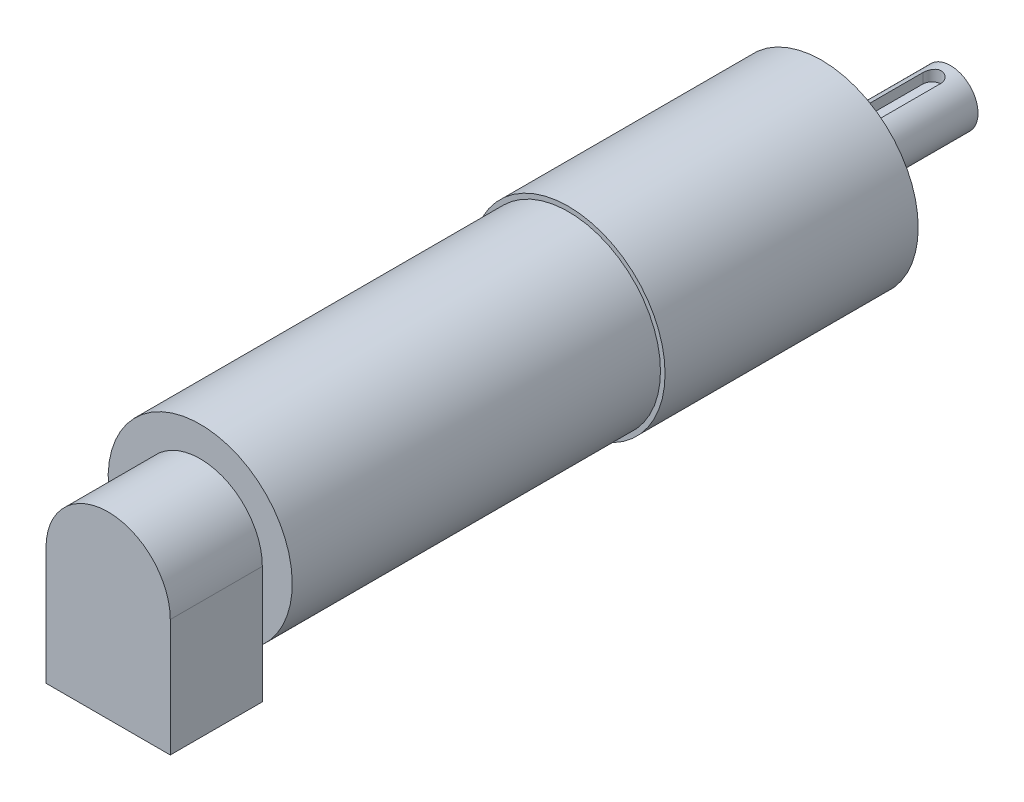
ISO-10303-21;
HEADER;
FILE_DESCRIPTION(('STEP AP214'),'2;1');
FILE_NAME('part.step','',(''),(''),'','','');
FILE_SCHEMA(('AUTOMOTIVE_DESIGN { 1 0 10303 214 1 1 1 1 }'));
ENDSEC;
DATA;
#1=APPLICATION_CONTEXT('core data for automotive mechanical design processes');
#2=APPLICATION_PROTOCOL_DEFINITION('international standard','automotive_design',2000,#1);
#3=PRODUCT_CONTEXT('',#1,'mechanical');
#4=PRODUCT('Part','Part','',(#3));
#5=PRODUCT_RELATED_PRODUCT_CATEGORY('part','',(#4));
#6=PRODUCT_DEFINITION_FORMATION('','',#4);
#7=PRODUCT_DEFINITION_CONTEXT('part definition',#1,'design');
#8=PRODUCT_DEFINITION('design','',#6,#7);
#9=PRODUCT_DEFINITION_SHAPE('','',#8);
#10=(LENGTH_UNIT() NAMED_UNIT(*) SI_UNIT(.MILLI.,.METRE.));
#11=(NAMED_UNIT(*) PLANE_ANGLE_UNIT() SI_UNIT($,.RADIAN.));
#12=(NAMED_UNIT(*) SI_UNIT($,.STERADIAN.) SOLID_ANGLE_UNIT());
#13=UNCERTAINTY_MEASURE_WITH_UNIT(LENGTH_MEASURE(1.E-05),#10,'distance_accuracy_value','');
#14=(GEOMETRIC_REPRESENTATION_CONTEXT(3) GLOBAL_UNCERTAINTY_ASSIGNED_CONTEXT((#13)) GLOBAL_UNIT_ASSIGNED_CONTEXT((#10,
#11,#12)) REPRESENTATION_CONTEXT('',''));
#15=CARTESIAN_POINT('',(0.,0.,0.));
#16=DIRECTION('',(0.,0.,1.));
#17=DIRECTION('',(1.,0.,0.));
#18=AXIS2_PLACEMENT_3D('',#15,#16,#17);
#19=CARTESIAN_POINT('',(0.,0.,-28.));
#20=DIRECTION('',(0.,0.,1.));
#21=DIRECTION('',(1.,0.,0.));
#22=AXIS2_PLACEMENT_3D('',#19,#20,#21);
#23=CYLINDRICAL_SURFACE('',#22,6.);
#24=DIRECTION('',(0.,0.,1.));
#25=VECTOR('',#24,1.);
#26=CARTESIAN_POINT('',(2.,5.65685424949238,-28.));
#27=LINE('',#26,#25);
#28=CARTESIAN_POINT('',(2.,5.65685424949238,-24.));
#29=VERTEX_POINT('',#28);
#30=CARTESIAN_POINT('',(2.,5.65685424949238,-8.));
#31=VERTEX_POINT('',#30);
#32=EDGE_CURVE('E12',#29,#31,#27,.T.);
#33=ORIENTED_EDGE('',*,*,#32,.T.);
#34=CARTESIAN_POINT('',(2.,5.65685424949238,-8.));
#35=CARTESIAN_POINT('',(2.0000014949184,5.65684884188678,-7.94541900639777));
#36=CARTESIAN_POINT('',(1.99776424917479,5.6576451988649,-7.89086587562134));
#37=CARTESIAN_POINT('',(1.9888512140728,5.66078654578442,-7.78218283189021));
#38=CARTESIAN_POINT('',(1.98217662286705,5.66313111768244,-7.72805280868061));
#39=CARTESIAN_POINT('',(1.95562135046158,5.67238184449302,-7.56721571360973));
#40=CARTESIAN_POINT('',(1.92920846605623,5.6815058499903,-7.46163830745904));
#41=CARTESIAN_POINT('',(1.85991682366086,5.70456149397718,-7.25674961511244));
#42=CARTESIAN_POINT('',(1.81704715197507,5.71849047905858,-7.15743490625415));
#43=CARTESIAN_POINT('',(1.71614645792974,5.74957574438921,-6.96732033198908));
#44=CARTESIAN_POINT('',(1.65810612564547,5.76673400456216,-6.87652574186531));
#45=CARTESIAN_POINT('',(1.52610278704603,5.80308960804095,-6.70255953735094));
#46=CARTESIAN_POINT('',(1.45164996064408,5.82233755536618,-6.61977023907478));
#47=CARTESIAN_POINT('',(1.28997688598297,5.86027697385956,-6.46758796441661));
#48=CARTESIAN_POINT('',(1.20275436910907,5.87896834543706,-6.39819737348812));
#49=CARTESIAN_POINT('',(1.01520729191253,5.91427765988454,-6.27304096239161));
#50=CARTESIAN_POINT('',(0.914600178716995,5.93082875123708,-6.21767803119549));
#51=CARTESIAN_POINT('',(0.70485849993172,5.95939217209317,-6.12481549662547));
#52=CARTESIAN_POINT('',(0.595726551186842,5.97140588786619,-6.08731043635913));
#53=CARTESIAN_POINT('',(0.376058690956075,5.98918142285845,-6.03252854781725));
#54=CARTESIAN_POINT('',(0.265703668920225,5.99514617977147,-6.01459345489264));
#55=CARTESIAN_POINT('',(0.0433979389113468,6.00087216807634,-5.99736740294878));
#56=CARTESIAN_POINT('',(-0.0685523824907842,6.00063487762605,-5.9980720014605));
#57=CARTESIAN_POINT('',(-0.286207690558784,5.99412077270532,-6.01768856621331));
#58=CARTESIAN_POINT('',(-0.391985405251073,5.98808121982527,-6.03588527591893));
#59=CARTESIAN_POINT('',(-0.598888128753312,5.97093921001647,-6.08878639734824));
#60=CARTESIAN_POINT('',(-0.700012879232928,5.95983647235462,-6.12349172441251));
#61=CARTESIAN_POINT('',(-0.896305246061924,5.93351336542608,-6.20884273920126));
#62=CARTESIAN_POINT('',(-0.991377011307984,5.91824075676625,-6.25969209024468));
#63=CARTESIAN_POINT('',(-1.17184917819498,5.88516775360088,-6.3757199027814));
#64=CARTESIAN_POINT('',(-1.25724693942937,5.86736667195186,-6.44090226209303));
#65=CARTESIAN_POINT('',(-1.42019467942242,5.83012543885479,-6.58734209999369));
#66=CARTESIAN_POINT('',(-1.4971872232254,5.81064757359828,-6.66921108721941));
#67=CARTESIAN_POINT('',(-1.63654404964077,5.77294980945703,-6.84488297943233));
#68=CARTESIAN_POINT('',(-1.69890360636763,5.75473031831507,-6.93868972480648));
#69=CARTESIAN_POINT('',(-1.80800665118557,5.72140062752635,-7.13736035670656));
#70=CARTESIAN_POINT('',(-1.85450601901536,5.70634029896469,-7.24236702986588));
#71=CARTESIAN_POINT('',(-1.92892046140223,5.68162194124078,-7.45929395517991));
#72=CARTESIAN_POINT('',(-1.95686487211071,5.67195538817986,-7.5712029867443));
#73=CARTESIAN_POINT('',(-1.98331631256166,5.6627308418944,-7.73683727349597));
#74=CARTESIAN_POINT('',(-1.98957012251023,5.66053335389204,-7.78928277970846));
#75=CARTESIAN_POINT('',(-1.99790923214239,5.65759407142798,-7.89447615679963));
#76=CARTESIAN_POINT('',(-1.99999991078996,5.65685039859056,-7.94722354908881));
#77=CARTESIAN_POINT('',(-2.,5.65685424949238,-8.));
#78=B_SPLINE_CURVE_WITH_KNOTS('',3,(#34,#35,#36,#37,#38,#39,#40,#41,#42,#43,#44,#45,#46,#47,#48,
#49,#50,#51,#52,#53,#54,#55,#56,#57,#58,#59,#60,#61,#62,#63,#64,#65,#66,#67,#68,#69,#70,#71,#72,
#73,#74,#75,#76,#77),.UNSPECIFIED.,.F.,.F.,(4,2,2,2,2,2,2,2,2,2,2,2,2,2,2,2,2,2,2,2,2,4),(0.,
0.163636969470865,0.327229772338923,0.653162396790745,0.978915321932473,1.30486862627062,
1.64233009925355,1.97985159727495,2.32618265866202,2.67240782242254,3.00658941454806,
3.34069136061285,3.6616883693147,3.98270317816496,4.30794037651935,4.63326613177537,
4.973881081161,5.31460588498484,5.6603605985608,6.00556734973678,6.16399790665503,
6.32222363058113),.UNSPECIFIED.);
#79=CARTESIAN_POINT('',(-2.,5.65685424949238,-8.));
#80=VERTEX_POINT('',#79);
#81=EDGE_CURVE('E118',#31,#80,#78,.T.);
#82=ORIENTED_EDGE('',*,*,#81,.T.);
#83=DIRECTION('',(0.,0.,1.));
#84=VECTOR('',#83,1.);
#85=CARTESIAN_POINT('',(-2.,5.65685424949238,-28.));
#86=LINE('',#85,#84);
#87=CARTESIAN_POINT('',(-2.,5.65685424949238,-24.));
#88=VERTEX_POINT('',#87);
#89=EDGE_CURVE('E53',#80,#88,#86,.F.);
#90=ORIENTED_EDGE('',*,*,#89,.T.);
#91=CARTESIAN_POINT('',(-2.,5.65685424949238,-24.));
#92=CARTESIAN_POINT('',(-2.0000014949184,5.65684884188678,-24.0545809936022));
#93=CARTESIAN_POINT('',(-1.99776424917479,5.6576451988649,-24.1091341243787));
#94=CARTESIAN_POINT('',(-1.98885121407281,5.66078654578442,-24.2178171681098));
#95=CARTESIAN_POINT('',(-1.98217662286705,5.66313111768244,-24.2719471913194));
#96=CARTESIAN_POINT('',(-1.95562135046158,5.67238184449302,-24.4327842863903));
#97=CARTESIAN_POINT('',(-1.92920846605623,5.6815058499903,-24.538361692541));
#98=CARTESIAN_POINT('',(-1.85991682366086,5.70456149397718,-24.7432503848876));
#99=CARTESIAN_POINT('',(-1.81704715197507,5.71849047905858,-24.8425650937458));
#100=CARTESIAN_POINT('',(-1.71614645792974,5.74957574438921,-25.0326796680109));
#101=CARTESIAN_POINT('',(-1.65810612564548,5.76673400456216,-25.1234742581347));
#102=CARTESIAN_POINT('',(-1.52610278704603,5.80308960804095,-25.2974404626491));
#103=CARTESIAN_POINT('',(-1.45164996064408,5.82233755536618,-25.3802297609252));
#104=CARTESIAN_POINT('',(-1.28997688598297,5.86027697385956,-25.5324120355834));
#105=CARTESIAN_POINT('',(-1.20275436910908,5.87896834543705,-25.6018026265119));
#106=CARTESIAN_POINT('',(-1.01520729191253,5.91427765988454,-25.7269590376084));
#107=CARTESIAN_POINT('',(-0.914600178716997,5.93082875123708,-25.7823219688045));
#108=CARTESIAN_POINT('',(-0.704858499931722,5.95939217209317,-25.8751845033745));
#109=CARTESIAN_POINT('',(-0.595726551186843,5.97140588786619,-25.9126895636409));
#110=CARTESIAN_POINT('',(-0.376058690956077,5.98918142285845,-25.9674714521827));
#111=CARTESIAN_POINT('',(-0.265703668920227,5.99514617977147,-25.9854065451074));
#112=CARTESIAN_POINT('',(-0.0433979389113496,6.00087216807634,-26.0026325970512));
#113=CARTESIAN_POINT('',(0.068552382490781,6.00063487762605,-26.0019279985395));
#114=CARTESIAN_POINT('',(0.28620769055878,5.99412077270532,-25.9823114337867));
#115=CARTESIAN_POINT('',(0.391985405251068,5.98808121982527,-25.9641147240811));
#116=CARTESIAN_POINT('',(0.598888128753308,5.97093921001647,-25.9112136026518));
#117=CARTESIAN_POINT('',(0.700012879232924,5.95983647235462,-25.8765082755875));
#118=CARTESIAN_POINT('',(0.896305246061921,5.93351336542609,-25.7911572607987));
#119=CARTESIAN_POINT('',(0.991377011307981,5.91824075676625,-25.7403079097553));
#120=CARTESIAN_POINT('',(1.17184917819497,5.88516775360088,-25.6242800972186));
#121=CARTESIAN_POINT('',(1.25724693942937,5.86736667195186,-25.559097737907));
#122=CARTESIAN_POINT('',(1.42019467942242,5.83012543885479,-25.4126579000063));
#123=CARTESIAN_POINT('',(1.4971872232254,5.81064757359828,-25.3307889127806));
#124=CARTESIAN_POINT('',(1.63654404964076,5.77294980945703,-25.1551170205677));
#125=CARTESIAN_POINT('',(1.69890360636762,5.75473031831506,-25.0613102751935));
#126=CARTESIAN_POINT('',(1.80800665118556,5.72140062752635,-24.8626396432934));
#127=CARTESIAN_POINT('',(1.85450601901536,5.70634029896469,-24.7576329701341));
#128=CARTESIAN_POINT('',(1.92892046140223,5.68162194124078,-24.5407060448201));
#129=CARTESIAN_POINT('',(1.95686487211071,5.67195538817986,-24.4287970132557));
#130=CARTESIAN_POINT('',(1.98331631256165,5.6627308418944,-24.263162726504));
#131=CARTESIAN_POINT('',(1.98957012251023,5.66053335389204,-24.2107172202915));
#132=CARTESIAN_POINT('',(1.99790923214239,5.65759407142798,-24.1055238432004));
#133=CARTESIAN_POINT('',(1.99999991078995,5.65685039859056,-24.0527764509112));
#134=CARTESIAN_POINT('',(2.,5.65685424949238,-24.));
#135=B_SPLINE_CURVE_WITH_KNOTS('',3,(#91,#92,#93,#94,#95,#96,#97,#98,#99,#100,#101,#102,#103,
#104,#105,#106,#107,#108,#109,#110,#111,#112,#113,#114,#115,#116,#117,#118,#119,#120,#121,#122,
#123,#124,#125,#126,#127,#128,#129,#130,#131,#132,#133,#134),.UNSPECIFIED.,.F.,.F.,(4,2,2,2,2,2,
2,2,2,2,2,2,2,2,2,2,2,2,2,2,2,4),(0.,0.163636969470864,0.327229772338923,0.653162396790745,
0.97891532193247,1.30486862627062,1.64233009925355,1.97985159727495,2.32618265866202,
2.67240782242255,3.00658941454806,3.34069136061284,3.6616883693147,3.98270317816496,
4.30794037651935,4.63326613177537,4.973881081161,5.31460588498485,5.6603605985608,
6.00556734973678,6.16399790665503,6.32222363058113),.UNSPECIFIED.);
#136=EDGE_CURVE('E60',#88,#29,#135,.T.);
#137=ORIENTED_EDGE('',*,*,#136,.T.);
#138=EDGE_LOOP('',(#33,#82,#90,#137));
#139=FACE_BOUND('',#138,.T.);
#140=CARTESIAN_POINT('',(0.,0.,-28.));
#141=DIRECTION('',(0.,0.,-1.));
#142=DIRECTION('',(-1.,0.,0.));
#143=AXIS2_PLACEMENT_3D('',#140,#141,#142);
#144=CIRCLE('',#143,6.);
#145=CARTESIAN_POINT('',(-6.,0.,-28.));
#146=VERTEX_POINT('',#145);
#147=EDGE_CURVE('E115',#146,#146,#144,.T.);
#148=ORIENTED_EDGE('',*,*,#147,.F.);
#149=EDGE_LOOP('',(#148));
#150=FACE_BOUND('',#149,.T.);
#151=CARTESIAN_POINT('',(0.,0.,-3.));
#152=DIRECTION('',(0.,0.,-1.));
#153=DIRECTION('',(-1.,0.,0.));
#154=AXIS2_PLACEMENT_3D('',#151,#152,#153);
#155=CIRCLE('',#154,6.);
#156=CARTESIAN_POINT('',(-6.,0.,-3.));
#157=VERTEX_POINT('',#156);
#158=EDGE_CURVE('E111',#157,#157,#155,.T.);
#159=ORIENTED_EDGE('',*,*,#158,.T.);
#160=EDGE_LOOP('',(#159));
#161=FACE_BOUND('',#160,.T.);
#162=ADVANCED_FACE('F45',(#139,#150,#161),#23,.T.);
#163=CARTESIAN_POINT('',(0.,0.,-28.));
#164=DIRECTION('',(0.,0.,-1.));
#165=DIRECTION('',(-1.,0.,0.));
#166=AXIS2_PLACEMENT_3D('',#163,#164,#165);
#167=PLANE('',#166);
#168=ORIENTED_EDGE('',*,*,#147,.T.);
#169=EDGE_LOOP('',(#168));
#170=FACE_BOUND('',#169,.T.);
#171=ADVANCED_FACE('F144',(#170),#167,.T.);
#172=CARTESIAN_POINT('',(0.,0.,-3.));
#173=DIRECTION('',(0.,0.,-1.));
#174=DIRECTION('',(-1.,0.,0.));
#175=AXIS2_PLACEMENT_3D('',#172,#173,#174);
#176=PLANE('',#175);
#177=ORIENTED_EDGE('',*,*,#158,.F.);
#178=EDGE_LOOP('',(#177));
#179=FACE_BOUND('',#178,.T.);
#180=ADVANCED_FACE('F143',(#179),#176,.F.);
#181=CARTESIAN_POINT('',(0.,3.5,-24.));
#182=DIRECTION('',(0.,1.,0.));
#183=DIRECTION('',(0.,0.,1.));
#184=AXIS2_PLACEMENT_3D('',#181,#182,#183);
#185=CYLINDRICAL_SURFACE('',#184,2.);
#186=DIRECTION('',(0.,1.,0.));
#187=VECTOR('',#186,1.);
#188=CARTESIAN_POINT('',(-2.,3.5,-24.));
#189=LINE('',#188,#187);
#190=CARTESIAN_POINT('',(-2.,3.5,-24.));
#191=VERTEX_POINT('',#190);
#192=EDGE_CURVE('E83',#191,#88,#189,.T.);
#193=ORIENTED_EDGE('',*,*,#192,.F.);
#194=CARTESIAN_POINT('',(0.,3.5,-24.));
#195=DIRECTION('',(0.,1.,0.));
#196=DIRECTION('',(0.,0.,1.));
#197=AXIS2_PLACEMENT_3D('',#194,#195,#196);
#198=CIRCLE('',#197,2.);
#199=CARTESIAN_POINT('',(2.,3.5,-24.));
#200=VERTEX_POINT('',#199);
#201=EDGE_CURVE('E87',#200,#191,#198,.T.);
#202=ORIENTED_EDGE('',*,*,#201,.F.);
#203=DIRECTION('',(0.,1.,0.));
#204=VECTOR('',#203,1.);
#205=CARTESIAN_POINT('',(2.,3.5,-24.));
#206=LINE('',#205,#204);
#207=EDGE_CURVE('E109',#200,#29,#206,.T.);
#208=ORIENTED_EDGE('',*,*,#207,.T.);
#209=ORIENTED_EDGE('',*,*,#136,.F.);
#210=EDGE_LOOP('',(#193,#202,#208,#209));
#211=FACE_BOUND('',#210,.T.);
#212=ADVANCED_FACE('F85',(#211),#185,.F.);
#213=CARTESIAN_POINT('',(2.,3.5,-24.));
#214=DIRECTION('',(1.,0.,0.));
#215=DIRECTION('',(0.,0.,-1.));
#216=AXIS2_PLACEMENT_3D('',#213,#214,#215);
#217=PLANE('',#216);
#218=ORIENTED_EDGE('',*,*,#207,.F.);
#219=DIRECTION('',(0.,0.,-1.));
#220=VECTOR('',#219,1.);
#221=CARTESIAN_POINT('',(2.,3.5,-24.));
#222=LINE('',#221,#220);
#223=CARTESIAN_POINT('',(2.,3.5,-8.));
#224=VERTEX_POINT('',#223);
#225=EDGE_CURVE('E92',#224,#200,#222,.T.);
#226=ORIENTED_EDGE('',*,*,#225,.F.);
#227=DIRECTION('',(0.,1.,0.));
#228=VECTOR('',#227,1.);
#229=CARTESIAN_POINT('',(2.,3.5,-8.));
#230=LINE('',#229,#228);
#231=EDGE_CURVE('E112',#224,#31,#230,.T.);
#232=ORIENTED_EDGE('',*,*,#231,.T.);
#233=ORIENTED_EDGE('',*,*,#32,.F.);
#234=EDGE_LOOP('',(#218,#226,#232,#233));
#235=FACE_BOUND('',#234,.T.);
#236=ADVANCED_FACE('F136',(#235),#217,.F.);
#237=CARTESIAN_POINT('',(0.,3.5,-8.));
#238=DIRECTION('',(0.,1.,0.));
#239=DIRECTION('',(0.,0.,1.));
#240=AXIS2_PLACEMENT_3D('',#237,#238,#239);
#241=CYLINDRICAL_SURFACE('',#240,2.);
#242=ORIENTED_EDGE('',*,*,#231,.F.);
#243=CARTESIAN_POINT('',(0.,3.5,-8.));
#244=DIRECTION('',(0.,1.,0.));
#245=DIRECTION('',(0.,0.,1.));
#246=AXIS2_PLACEMENT_3D('',#243,#244,#245);
#247=CIRCLE('',#246,2.);
#248=CARTESIAN_POINT('',(-2.,3.5,-8.));
#249=VERTEX_POINT('',#248);
#250=EDGE_CURVE('E101',#249,#224,#247,.T.);
#251=ORIENTED_EDGE('',*,*,#250,.F.);
#252=DIRECTION('',(0.,1.,0.));
#253=VECTOR('',#252,1.);
#254=CARTESIAN_POINT('',(-2.,3.5,-8.));
#255=LINE('',#254,#253);
#256=EDGE_CURVE('E91',#249,#80,#255,.T.);
#257=ORIENTED_EDGE('',*,*,#256,.T.);
#258=ORIENTED_EDGE('',*,*,#81,.F.);
#259=EDGE_LOOP('',(#242,#251,#257,#258));
#260=FACE_BOUND('',#259,.T.);
#261=ADVANCED_FACE('F131',(#260),#241,.F.);
#262=CARTESIAN_POINT('',(-2.,3.5,-24.));
#263=DIRECTION('',(-1.,0.,0.));
#264=DIRECTION('',(0.,0.,1.));
#265=AXIS2_PLACEMENT_3D('',#262,#263,#264);
#266=PLANE('',#265);
#267=ORIENTED_EDGE('',*,*,#256,.F.);
#268=DIRECTION('',(0.,0.,1.));
#269=VECTOR('',#268,1.);
#270=CARTESIAN_POINT('',(-2.,3.5,-24.));
#271=LINE('',#270,#269);
#272=EDGE_CURVE('E95',#191,#249,#271,.T.);
#273=ORIENTED_EDGE('',*,*,#272,.F.);
#274=ORIENTED_EDGE('',*,*,#192,.T.);
#275=ORIENTED_EDGE('',*,*,#89,.F.);
#276=EDGE_LOOP('',(#267,#273,#274,#275));
#277=FACE_BOUND('',#276,.T.);
#278=ADVANCED_FACE('F96',(#277),#266,.F.);
#279=CARTESIAN_POINT('',(0.,3.5,-24.));
#280=DIRECTION('',(0.,1.,0.));
#281=DIRECTION('',(0.,0.,1.));
#282=AXIS2_PLACEMENT_3D('',#279,#280,#281);
#283=PLANE('',#282);
#284=ORIENTED_EDGE('',*,*,#201,.T.);
#285=ORIENTED_EDGE('',*,*,#272,.T.);
#286=ORIENTED_EDGE('',*,*,#250,.T.);
#287=ORIENTED_EDGE('',*,*,#225,.T.);
#288=EDGE_LOOP('',(#284,#285,#286,#287));
#289=FACE_BOUND('',#288,.T.);
#290=ADVANCED_FACE('F103',(#289),#283,.T.);
#291=CLOSED_SHELL('',(#162,#171,#180,#212,#236,#261,#278,#290));
#292=MANIFOLD_SOLID_BREP('B2',#291);
#293=CARTESIAN_POINT('',(0.,0.,0.));
#294=DIRECTION('',(0.,0.,1.));
#295=DIRECTION('',(1.,0.,0.));
#296=AXIS2_PLACEMENT_3D('',#293,#294,#295);
#297=PLANE('',#296);
#298=CARTESIAN_POINT('',(0.,17.5,0.));
#299=DIRECTION('',(0.,0.,-1.));
#300=DIRECTION('',(-1.,0.,0.));
#301=AXIS2_PLACEMENT_3D('',#298,#299,#300);
#302=CIRCLE('',#301,1.64999999999999);
#303=CARTESIAN_POINT('',(-1.64999999999999,17.5,0.));
#304=VERTEX_POINT('',#303);
#305=EDGE_CURVE('E277',#304,#304,#302,.T.);
#306=ORIENTED_EDGE('',*,*,#305,.F.);
#307=EDGE_LOOP('',(#306));
#308=FACE_BOUND('',#307,.T.);
#309=CARTESIAN_POINT('',(-17.5000000000002,2.46546825617527E-13,0.));
#310=DIRECTION('',(0.,0.,-1.));
#311=DIRECTION('',(-1.,0.,0.));
#312=AXIS2_PLACEMENT_3D('',#309,#310,#311);
#313=CIRCLE('',#312,1.64999999999999);
#314=CARTESIAN_POINT('',(-19.1500000000002,2.46546825617527E-13,0.));
#315=VERTEX_POINT('',#314);
#316=EDGE_CURVE('E276',#315,#315,#313,.T.);
#317=ORIENTED_EDGE('',*,*,#316,.F.);
#318=EDGE_LOOP('',(#317));
#319=FACE_BOUND('',#318,.T.);
#320=CARTESIAN_POINT('',(-4.93093651235054E-13,-17.5,0.));
#321=DIRECTION('',(0.,0.,-1.));
#322=DIRECTION('',(-1.,0.,0.));
#323=AXIS2_PLACEMENT_3D('',#320,#321,#322);
#324=CIRCLE('',#323,1.64999999999999);
#325=CARTESIAN_POINT('',(-1.65000000000048,-17.5,0.));
#326=VERTEX_POINT('',#325);
#327=EDGE_CURVE('E287',#326,#326,#324,.T.);
#328=ORIENTED_EDGE('',*,*,#327,.F.);
#329=EDGE_LOOP('',(#328));
#330=FACE_BOUND('',#329,.T.);
#331=CARTESIAN_POINT('',(17.4999999999998,-2.44403693719019E-13,0.));
#332=DIRECTION('',(0.,0.,-1.));
#333=DIRECTION('',(-1.,0.,0.));
#334=AXIS2_PLACEMENT_3D('',#331,#332,#333);
#335=CIRCLE('',#334,1.64999999999999);
#336=CARTESIAN_POINT('',(15.8499999999998,-2.44403693719019E-13,0.));
#337=VERTEX_POINT('',#336);
#338=EDGE_CURVE('E293',#337,#337,#335,.T.);
#339=ORIENTED_EDGE('',*,*,#338,.F.);
#340=EDGE_LOOP('',(#339));
#341=FACE_BOUND('',#340,.T.);
#342=CARTESIAN_POINT('',(0.,0.,0.));
#343=DIRECTION('',(0.,0.,1.));
#344=DIRECTION('',(1.,0.,0.));
#345=AXIS2_PLACEMENT_3D('',#342,#343,#344);
#346=CIRCLE('',#345,21.);
#347=CARTESIAN_POINT('',(21.,0.,0.));
#348=VERTEX_POINT('',#347);
#349=EDGE_CURVE('E334',#348,#348,#346,.T.);
#350=ORIENTED_EDGE('',*,*,#349,.F.);
#351=EDGE_LOOP('',(#350));
#352=FACE_BOUND('',#351,.T.);
#353=CARTESIAN_POINT('',(0.,0.,0.));
#354=DIRECTION('',(0.,0.,1.));
#355=DIRECTION('',(1.,0.,0.));
#356=AXIS2_PLACEMENT_3D('',#353,#354,#355);
#357=CIRCLE('',#356,14.);
#358=CARTESIAN_POINT('',(14.,0.,0.));
#359=VERTEX_POINT('',#358);
#360=EDGE_CURVE('E43',#359,#359,#357,.F.);
#361=ORIENTED_EDGE('',*,*,#360,.F.);
#362=EDGE_LOOP('',(#361));
#363=FACE_BOUND('',#362,.T.);
#364=ADVANCED_FACE('F209',(#308,#319,#330,#341,#352,#363),#297,.F.);
#365=CARTESIAN_POINT('',(0.,0.,55.));
#366=DIRECTION('',(0.,0.,1.));
#367=DIRECTION('',(1.,0.,0.));
#368=AXIS2_PLACEMENT_3D('',#365,#366,#367);
#369=PLANE('',#368);
#370=CARTESIAN_POINT('',(0.,0.,55.));
#371=DIRECTION('',(0.,0.,1.));
#372=DIRECTION('',(1.,0.,0.));
#373=AXIS2_PLACEMENT_3D('',#370,#371,#372);
#374=CIRCLE('',#373,21.);
#375=CARTESIAN_POINT('',(21.,0.,55.));
#376=VERTEX_POINT('',#375);
#377=EDGE_CURVE('E338',#376,#376,#374,.T.);
#378=ORIENTED_EDGE('',*,*,#377,.T.);
#379=EDGE_LOOP('',(#378));
#380=FACE_BOUND('',#379,.T.);
#381=CARTESIAN_POINT('',(0.,0.,55.));
#382=DIRECTION('',(0.,0.,1.));
#383=DIRECTION('',(1.,0.,0.));
#384=AXIS2_PLACEMENT_3D('',#381,#382,#383);
#385=CIRCLE('',#384,20.);
#386=CARTESIAN_POINT('',(20.,0.,55.));
#387=VERTEX_POINT('',#386);
#388=EDGE_CURVE('E330',#387,#387,#385,.T.);
#389=ORIENTED_EDGE('',*,*,#388,.F.);
#390=EDGE_LOOP('',(#389));
#391=FACE_BOUND('',#390,.T.);
#392=ADVANCED_FACE('F346',(#380,#391),#369,.T.);
#393=CARTESIAN_POINT('',(0.,0.,55.));
#394=DIRECTION('',(0.,0.,-1.));
#395=DIRECTION('',(-1.,0.,0.));
#396=AXIS2_PLACEMENT_3D('',#393,#394,#395);
#397=CYLINDRICAL_SURFACE('',#396,21.);
#398=ORIENTED_EDGE('',*,*,#377,.F.);
#399=EDGE_LOOP('',(#398));
#400=FACE_BOUND('',#399,.T.);
#401=ORIENTED_EDGE('',*,*,#349,.T.);
#402=EDGE_LOOP('',(#401));
#403=FACE_BOUND('',#402,.T.);
#404=ADVANCED_FACE('F211',(#400,#403),#397,.T.);
#405=CARTESIAN_POINT('',(0.,0.,135.));
#406=DIRECTION('',(0.,0.,-1.));
#407=DIRECTION('',(-1.,0.,0.));
#408=AXIS2_PLACEMENT_3D('',#405,#406,#407);
#409=CYLINDRICAL_SURFACE('',#408,20.);
#410=CARTESIAN_POINT('',(0.,0.,135.));
#411=DIRECTION('',(0.,0.,1.));
#412=DIRECTION('',(1.,0.,0.));
#413=AXIS2_PLACEMENT_3D('',#410,#411,#412);
#414=CIRCLE('',#413,20.);
#415=CARTESIAN_POINT('',(-13.5,-14.7563545633737,135.));
#416=VERTEX_POINT('',#415);
#417=CARTESIAN_POINT('',(13.5,-14.7563545633737,135.));
#418=VERTEX_POINT('',#417);
#419=EDGE_CURVE('E331',#416,#418,#414,.T.);
#420=ORIENTED_EDGE('',*,*,#419,.F.);
#421=EDGE_CURVE('E335',#418,#416,#414,.T.);
#422=ORIENTED_EDGE('',*,*,#421,.F.);
#423=EDGE_LOOP('',(#420,#422));
#424=FACE_BOUND('',#423,.T.);
#425=ORIENTED_EDGE('',*,*,#388,.T.);
#426=EDGE_LOOP('',(#425));
#427=FACE_BOUND('',#426,.T.);
#428=ADVANCED_FACE('F391',(#424,#427),#409,.T.);
#429=CARTESIAN_POINT('',(0.,0.,135.));
#430=DIRECTION('',(0.,0.,1.));
#431=DIRECTION('',(1.,0.,0.));
#432=AXIS2_PLACEMENT_3D('',#429,#430,#431);
#433=PLANE('',#432);
#434=DIRECTION('',(0.,1.,0.));
#435=VECTOR('',#434,1.);
#436=CARTESIAN_POINT('',(13.5,-25.5,135.));
#437=LINE('',#436,#435);
#438=CARTESIAN_POINT('',(13.5,0.,135.));
#439=VERTEX_POINT('',#438);
#440=EDGE_CURVE('E217',#418,#439,#437,.T.);
#441=ORIENTED_EDGE('',*,*,#440,.F.);
#442=ORIENTED_EDGE('',*,*,#421,.T.);
#443=DIRECTION('',(0.,-1.,0.));
#444=VECTOR('',#443,1.);
#445=CARTESIAN_POINT('',(-13.5,-25.5,135.));
#446=LINE('',#445,#444);
#447=CARTESIAN_POINT('',(-13.5,0.,135.));
#448=VERTEX_POINT('',#447);
#449=EDGE_CURVE('E229',#448,#416,#446,.T.);
#450=ORIENTED_EDGE('',*,*,#449,.F.);
#451=CARTESIAN_POINT('',(0.,0.,135.));
#452=DIRECTION('',(0.,0.,1.));
#453=DIRECTION('',(1.,0.,0.));
#454=AXIS2_PLACEMENT_3D('',#451,#452,#453);
#455=CIRCLE('',#454,13.5);
#456=EDGE_CURVE('E224',#439,#448,#455,.T.);
#457=ORIENTED_EDGE('',*,*,#456,.F.);
#458=EDGE_LOOP('',(#441,#442,#450,#457));
#459=FACE_BOUND('',#458,.T.);
#460=ADVANCED_FACE('F373',(#459),#433,.T.);
#461=CARTESIAN_POINT('',(0.,0.,135.));
#462=DIRECTION('',(0.,0.,1.));
#463=DIRECTION('',(1.,0.,0.));
#464=AXIS2_PLACEMENT_3D('',#461,#462,#463);
#465=PLANE('',#464);
#466=CARTESIAN_POINT('',(-13.5,-25.5,135.));
#467=VERTEX_POINT('',#466);
#468=EDGE_CURVE('E314',#416,#467,#446,.T.);
#469=ORIENTED_EDGE('',*,*,#468,.F.);
#470=ORIENTED_EDGE('',*,*,#419,.T.);
#471=CARTESIAN_POINT('',(13.5,-25.5,135.));
#472=VERTEX_POINT('',#471);
#473=EDGE_CURVE('E306',#472,#418,#437,.T.);
#474=ORIENTED_EDGE('',*,*,#473,.F.);
#475=DIRECTION('',(1.,0.,0.));
#476=VECTOR('',#475,1.);
#477=CARTESIAN_POINT('',(-13.5,-25.5,135.));
#478=LINE('',#477,#476);
#479=EDGE_CURVE('E316',#467,#472,#478,.T.);
#480=ORIENTED_EDGE('',*,*,#479,.F.);
#481=EDGE_LOOP('',(#469,#470,#474,#480));
#482=FACE_BOUND('',#481,.T.);
#483=ADVANCED_FACE('F369',(#482),#465,.F.);
#484=CARTESIAN_POINT('',(0.,0.,155.));
#485=DIRECTION('',(0.,0.,-1.));
#486=DIRECTION('',(-1.,0.,0.));
#487=AXIS2_PLACEMENT_3D('',#484,#485,#486);
#488=CYLINDRICAL_SURFACE('',#487,13.5);
#489=ORIENTED_EDGE('',*,*,#456,.T.);
#490=DIRECTION('',(0.,0.,-1.));
#491=VECTOR('',#490,1.);
#492=CARTESIAN_POINT('',(-13.5,0.,155.));
#493=LINE('',#492,#491);
#494=CARTESIAN_POINT('',(-13.5,0.,155.));
#495=VERTEX_POINT('',#494);
#496=EDGE_CURVE('E328',#495,#448,#493,.T.);
#497=ORIENTED_EDGE('',*,*,#496,.F.);
#498=CARTESIAN_POINT('',(0.,0.,155.));
#499=DIRECTION('',(0.,0.,1.));
#500=DIRECTION('',(1.,0.,0.));
#501=AXIS2_PLACEMENT_3D('',#498,#499,#500);
#502=CIRCLE('',#501,13.5);
#503=CARTESIAN_POINT('',(13.5,0.,155.));
#504=VERTEX_POINT('',#503);
#505=EDGE_CURVE('E302',#504,#495,#502,.T.);
#506=ORIENTED_EDGE('',*,*,#505,.F.);
#507=DIRECTION('',(0.,0.,-1.));
#508=VECTOR('',#507,1.);
#509=CARTESIAN_POINT('',(13.5,0.,155.));
#510=LINE('',#509,#508);
#511=EDGE_CURVE('E312',#504,#439,#510,.T.);
#512=ORIENTED_EDGE('',*,*,#511,.T.);
#513=EDGE_LOOP('',(#489,#497,#506,#512));
#514=FACE_BOUND('',#513,.T.);
#515=ADVANCED_FACE('F372',(#514),#488,.T.);
#516=CARTESIAN_POINT('',(-13.5,-25.5,155.));
#517=DIRECTION('',(1.,0.,0.));
#518=DIRECTION('',(0.,0.,-1.));
#519=AXIS2_PLACEMENT_3D('',#516,#517,#518);
#520=PLANE('',#519);
#521=ORIENTED_EDGE('',*,*,#449,.T.);
#522=ORIENTED_EDGE('',*,*,#468,.T.);
#523=DIRECTION('',(0.,0.,-1.));
#524=VECTOR('',#523,1.);
#525=CARTESIAN_POINT('',(-13.5,-25.5,155.));
#526=LINE('',#525,#524);
#527=CARTESIAN_POINT('',(-13.5,-25.5,155.));
#528=VERTEX_POINT('',#527);
#529=EDGE_CURVE('E325',#528,#467,#526,.T.);
#530=ORIENTED_EDGE('',*,*,#529,.F.);
#531=DIRECTION('',(0.,-1.,0.));
#532=VECTOR('',#531,1.);
#533=CARTESIAN_POINT('',(-13.5,-25.5,155.));
#534=LINE('',#533,#532);
#535=EDGE_CURVE('E305',#495,#528,#534,.T.);
#536=ORIENTED_EDGE('',*,*,#535,.F.);
#537=ORIENTED_EDGE('',*,*,#496,.T.);
#538=EDGE_LOOP('',(#521,#522,#530,#536,#537));
#539=FACE_BOUND('',#538,.T.);
#540=ADVANCED_FACE('F381',(#539),#520,.F.);
#541=CARTESIAN_POINT('',(-13.5,-25.5,155.));
#542=DIRECTION('',(0.,1.,0.));
#543=DIRECTION('',(0.,0.,1.));
#544=AXIS2_PLACEMENT_3D('',#541,#542,#543);
#545=PLANE('',#544);
#546=ORIENTED_EDGE('',*,*,#479,.T.);
#547=DIRECTION('',(0.,0.,-1.));
#548=VECTOR('',#547,1.);
#549=CARTESIAN_POINT('',(13.5,-25.5,155.));
#550=LINE('',#549,#548);
#551=CARTESIAN_POINT('',(13.5,-25.5,155.));
#552=VERTEX_POINT('',#551);
#553=EDGE_CURVE('E322',#552,#472,#550,.T.);
#554=ORIENTED_EDGE('',*,*,#553,.F.);
#555=DIRECTION('',(1.,0.,0.));
#556=VECTOR('',#555,1.);
#557=CARTESIAN_POINT('',(-13.5,-25.5,155.));
#558=LINE('',#557,#556);
#559=EDGE_CURVE('E308',#528,#552,#558,.T.);
#560=ORIENTED_EDGE('',*,*,#559,.F.);
#561=ORIENTED_EDGE('',*,*,#529,.T.);
#562=EDGE_LOOP('',(#546,#554,#560,#561));
#563=FACE_BOUND('',#562,.T.);
#564=ADVANCED_FACE('F377',(#563),#545,.F.);
#565=CARTESIAN_POINT('',(13.5,-25.5,155.));
#566=DIRECTION('',(-1.,0.,0.));
#567=DIRECTION('',(0.,-1.,0.));
#568=AXIS2_PLACEMENT_3D('',#565,#566,#567);
#569=PLANE('',#568);
#570=ORIENTED_EDGE('',*,*,#473,.T.);
#571=ORIENTED_EDGE('',*,*,#440,.T.);
#572=ORIENTED_EDGE('',*,*,#511,.F.);
#573=DIRECTION('',(0.,1.,0.));
#574=VECTOR('',#573,1.);
#575=CARTESIAN_POINT('',(13.5,-25.5,155.));
#576=LINE('',#575,#574);
#577=EDGE_CURVE('E310',#552,#504,#576,.T.);
#578=ORIENTED_EDGE('',*,*,#577,.F.);
#579=ORIENTED_EDGE('',*,*,#553,.T.);
#580=EDGE_LOOP('',(#570,#571,#572,#578,#579));
#581=FACE_BOUND('',#580,.T.);
#582=ADVANCED_FACE('F363',(#581),#569,.F.);
#583=CARTESIAN_POINT('',(0.,0.,155.));
#584=DIRECTION('',(0.,0.,1.));
#585=DIRECTION('',(1.,0.,0.));
#586=AXIS2_PLACEMENT_3D('',#583,#584,#585);
#587=PLANE('',#586);
#588=ORIENTED_EDGE('',*,*,#505,.T.);
#589=ORIENTED_EDGE('',*,*,#535,.T.);
#590=ORIENTED_EDGE('',*,*,#559,.T.);
#591=ORIENTED_EDGE('',*,*,#577,.T.);
#592=EDGE_LOOP('',(#588,#589,#590,#591));
#593=FACE_BOUND('',#592,.T.);
#594=ADVANCED_FACE('F353',(#593),#587,.T.);
#595=CARTESIAN_POINT('',(0.,0.,-3.));
#596=DIRECTION('',(0.,0.,1.));
#597=DIRECTION('',(1.,0.,0.));
#598=AXIS2_PLACEMENT_3D('',#595,#596,#597);
#599=CYLINDRICAL_SURFACE('',#598,14.);
#600=CARTESIAN_POINT('',(0.,0.,-3.));
#601=DIRECTION('',(0.,0.,-1.));
#602=DIRECTION('',(-1.,0.,0.));
#603=AXIS2_PLACEMENT_3D('',#600,#601,#602);
#604=CIRCLE('',#603,14.);
#605=CARTESIAN_POINT('',(-14.,0.,-3.));
#606=VERTEX_POINT('',#605);
#607=EDGE_CURVE('E299',#606,#606,#604,.T.);
#608=ORIENTED_EDGE('',*,*,#607,.F.);
#609=EDGE_LOOP('',(#608));
#610=FACE_BOUND('',#609,.T.);
#611=ORIENTED_EDGE('',*,*,#360,.T.);
#612=EDGE_LOOP('',(#611));
#613=FACE_BOUND('',#612,.T.);
#614=ADVANCED_FACE('F350',(#610,#613),#599,.T.);
#615=CARTESIAN_POINT('',(0.,0.,-3.));
#616=DIRECTION('',(0.,0.,-1.));
#617=DIRECTION('',(-1.,0.,0.));
#618=AXIS2_PLACEMENT_3D('',#615,#616,#617);
#619=PLANE('',#618);
#620=ORIENTED_EDGE('',*,*,#607,.T.);
#621=EDGE_LOOP('',(#620));
#622=FACE_BOUND('',#621,.T.);
#623=ADVANCED_FACE('F352',(#622),#619,.T.);
#624=CARTESIAN_POINT('',(17.4999999999998,-2.44403693719019E-13,6.));
#625=DIRECTION('',(0.,0.,-1.));
#626=DIRECTION('',(-1.,0.,0.));
#627=AXIS2_PLACEMENT_3D('',#624,#625,#626);
#628=CONICAL_SURFACE('',#627,1.65,1.02974425867665);
#629=CARTESIAN_POINT('',(17.4999999999998,-2.44403693719019E-13,6.99142002139547));
#630=VERTEX_POINT('',#629);
#631=VERTEX_LOOP('',#630);
#632=FACE_BOUND('',#631,.T.);
#633=CARTESIAN_POINT('',(17.4999999999998,-2.44403693719019E-13,6.));
#634=DIRECTION('',(0.,0.,-1.));
#635=DIRECTION('',(-1.,0.,0.));
#636=AXIS2_PLACEMENT_3D('',#633,#634,#635);
#637=CIRCLE('',#636,1.65);
#638=CARTESIAN_POINT('',(15.8499999999998,-2.44403693719019E-13,6.));
#639=VERTEX_POINT('',#638);
#640=EDGE_CURVE('E296',#639,#639,#637,.T.);
#641=ORIENTED_EDGE('',*,*,#640,.T.);
#642=EDGE_LOOP('',(#641));
#643=FACE_BOUND('',#642,.T.);
#644=ADVANCED_FACE('F360',(#632,#643),#628,.F.);
#645=CARTESIAN_POINT('',(17.4999999999998,-2.44403693719019E-13,0.));
#646=DIRECTION('',(0.,0.,-1.));
#647=DIRECTION('',(-1.,0.,0.));
#648=AXIS2_PLACEMENT_3D('',#645,#646,#647);
#649=CYLINDRICAL_SURFACE('',#648,1.64999999999999);
#650=ORIENTED_EDGE('',*,*,#640,.F.);
#651=EDGE_LOOP('',(#650));
#652=FACE_BOUND('',#651,.T.);
#653=ORIENTED_EDGE('',*,*,#338,.T.);
#654=EDGE_LOOP('',(#653));
#655=FACE_BOUND('',#654,.T.);
#656=ADVANCED_FACE('F464',(#652,#655),#649,.F.);
#657=CARTESIAN_POINT('',(-4.93093651235054E-13,-17.5,6.));
#658=DIRECTION('',(0.,0.,-1.));
#659=DIRECTION('',(-1.,0.,0.));
#660=AXIS2_PLACEMENT_3D('',#657,#658,#659);
#661=CONICAL_SURFACE('',#660,1.65,1.02974425867665);
#662=CARTESIAN_POINT('',(-4.94806055265194E-13,-17.5,6.99142002139547));
#663=VERTEX_POINT('',#662);
#664=VERTEX_LOOP('',#663);
#665=FACE_BOUND('',#664,.T.);
#666=CARTESIAN_POINT('',(-4.93093651235054E-13,-17.5,6.));
#667=DIRECTION('',(0.,0.,-1.));
#668=DIRECTION('',(-1.,0.,0.));
#669=AXIS2_PLACEMENT_3D('',#666,#667,#668);
#670=CIRCLE('',#669,1.65);
#671=CARTESIAN_POINT('',(-1.65000000000049,-17.5,6.));
#672=VERTEX_POINT('',#671);
#673=EDGE_CURVE('E290',#672,#672,#670,.T.);
#674=ORIENTED_EDGE('',*,*,#673,.T.);
#675=EDGE_LOOP('',(#674));
#676=FACE_BOUND('',#675,.T.);
#677=ADVANCED_FACE('F474',(#665,#676),#661,.F.);
#678=CARTESIAN_POINT('',(-4.93093651235054E-13,-17.5,0.));
#679=DIRECTION('',(0.,0.,-1.));
#680=DIRECTION('',(-1.,0.,0.));
#681=AXIS2_PLACEMENT_3D('',#678,#679,#680);
#682=CYLINDRICAL_SURFACE('',#681,1.64999999999999);
#683=ORIENTED_EDGE('',*,*,#673,.F.);
#684=EDGE_LOOP('',(#683));
#685=FACE_BOUND('',#684,.T.);
#686=ORIENTED_EDGE('',*,*,#327,.T.);
#687=EDGE_LOOP('',(#686));
#688=FACE_BOUND('',#687,.T.);
#689=ADVANCED_FACE('F485',(#685,#688),#682,.F.);
#690=CARTESIAN_POINT('',(-17.5000000000002,2.46546825617527E-13,6.));
#691=DIRECTION('',(0.,0.,-1.));
#692=DIRECTION('',(-1.,0.,0.));
#693=AXIS2_PLACEMENT_3D('',#690,#691,#692);
#694=CONICAL_SURFACE('',#693,1.65,1.02974425867665);
#695=CARTESIAN_POINT('',(-17.5000000000002,2.46546825617527E-13,6.99142002139547));
#696=VERTEX_POINT('',#695);
#697=VERTEX_LOOP('',#696);
#698=FACE_BOUND('',#697,.T.);
#699=CARTESIAN_POINT('',(-17.5000000000002,2.46546825617527E-13,6.));
#700=DIRECTION('',(0.,0.,-1.));
#701=DIRECTION('',(-1.,0.,0.));
#702=AXIS2_PLACEMENT_3D('',#699,#700,#701);
#703=CIRCLE('',#702,1.65);
#704=CARTESIAN_POINT('',(-19.1500000000002,2.46546825617527E-13,6.));
#705=VERTEX_POINT('',#704);
#706=EDGE_CURVE('E280',#705,#705,#703,.T.);
#707=ORIENTED_EDGE('',*,*,#706,.T.);
#708=EDGE_LOOP('',(#707));
#709=FACE_BOUND('',#708,.T.);
#710=ADVANCED_FACE('F495',(#698,#709),#694,.F.);
#711=CARTESIAN_POINT('',(-17.5000000000002,2.46546825617527E-13,0.));
#712=DIRECTION('',(0.,0.,-1.));
#713=DIRECTION('',(-1.,0.,0.));
#714=AXIS2_PLACEMENT_3D('',#711,#712,#713);
#715=CYLINDRICAL_SURFACE('',#714,1.64999999999999);
#716=ORIENTED_EDGE('',*,*,#706,.F.);
#717=EDGE_LOOP('',(#716));
#718=FACE_BOUND('',#717,.T.);
#719=ORIENTED_EDGE('',*,*,#316,.T.);
#720=EDGE_LOOP('',(#719));
#721=FACE_BOUND('',#720,.T.);
#722=ADVANCED_FACE('F270',(#718,#721),#715,.F.);
#723=CARTESIAN_POINT('',(0.,17.5,6.));
#724=DIRECTION('',(0.,0.,-1.));
#725=DIRECTION('',(-1.,0.,0.));
#726=AXIS2_PLACEMENT_3D('',#723,#724,#725);
#727=CONICAL_SURFACE('',#726,1.65,1.02974425867665);
#728=CARTESIAN_POINT('',(0.,17.5,6.99142002139547));
#729=VERTEX_POINT('',#728);
#730=VERTEX_LOOP('',#729);
#731=FACE_BOUND('',#730,.T.);
#732=CARTESIAN_POINT('',(0.,17.5,6.));
#733=DIRECTION('',(0.,0.,-1.));
#734=DIRECTION('',(-1.,0.,0.));
#735=AXIS2_PLACEMENT_3D('',#732,#733,#734);
#736=CIRCLE('',#735,1.65);
#737=CARTESIAN_POINT('',(-1.65,17.5,6.));
#738=VERTEX_POINT('',#737);
#739=EDGE_CURVE('E274',#738,#738,#736,.T.);
#740=ORIENTED_EDGE('',*,*,#739,.T.);
#741=EDGE_LOOP('',(#740));
#742=FACE_BOUND('',#741,.T.);
#743=ADVANCED_FACE('F266',(#731,#742),#727,.F.);
#744=CARTESIAN_POINT('',(0.,17.5,0.));
#745=DIRECTION('',(0.,0.,-1.));
#746=DIRECTION('',(-1.,0.,0.));
#747=AXIS2_PLACEMENT_3D('',#744,#745,#746);
#748=CYLINDRICAL_SURFACE('',#747,1.64999999999999);
#749=ORIENTED_EDGE('',*,*,#739,.F.);
#750=EDGE_LOOP('',(#749));
#751=FACE_BOUND('',#750,.T.);
#752=ORIENTED_EDGE('',*,*,#305,.T.);
#753=EDGE_LOOP('',(#752));
#754=FACE_BOUND('',#753,.T.);
#755=ADVANCED_FACE('F269',(#751,#754),#748,.F.);
#756=CLOSED_SHELL('',(#364,#392,#404,#428,#460,#483,#515,#540,#564,#582,#594,#614,#623,#644,
#656,#677,#689,#710,#722,#743,#755));
#757=MANIFOLD_SOLID_BREP('B6',#756);
#758=ADVANCED_BREP_SHAPE_REPRESENTATION('',(#18,#292,#757),#14);
#759=SHAPE_DEFINITION_REPRESENTATION(#9,#758);
ENDSEC;
END-ISO-10303-21;
